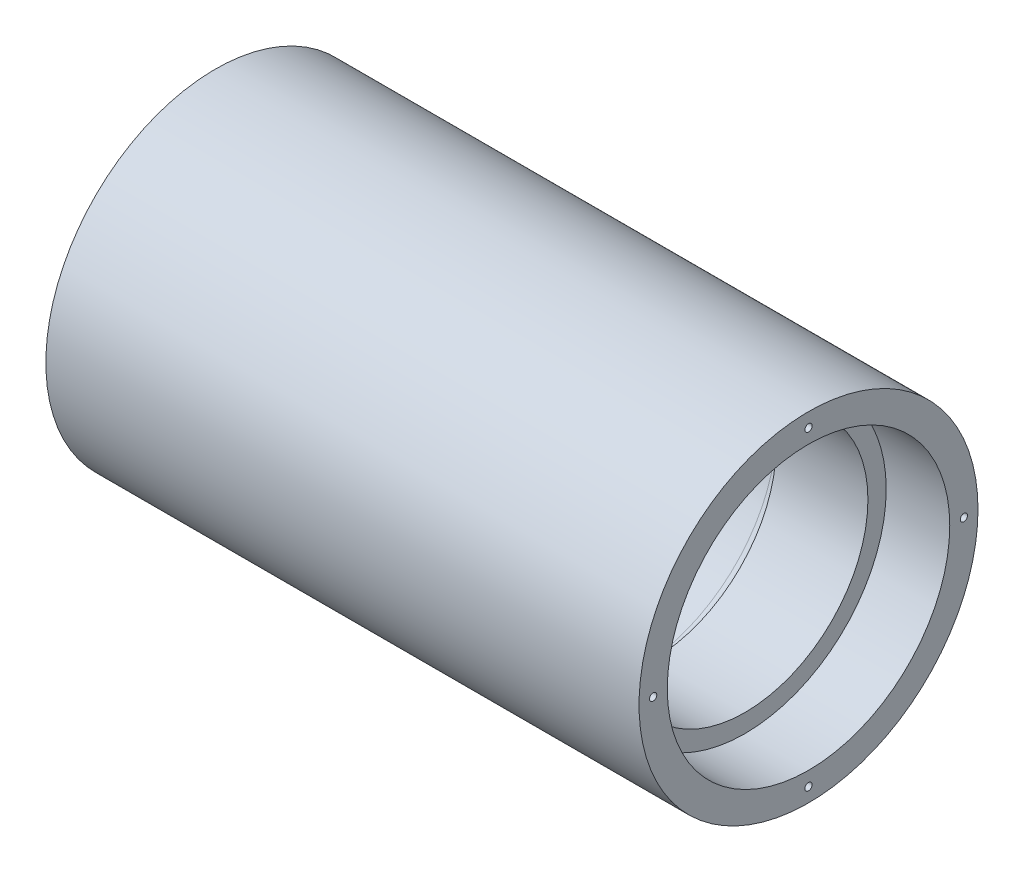
ISO-10303-21;
HEADER;
FILE_DESCRIPTION(('STEP AP214'),'2;1');
FILE_NAME('part.step','',(''),(''),'','','');
FILE_SCHEMA(('AUTOMOTIVE_DESIGN { 1 0 10303 214 1 1 1 1 }'));
ENDSEC;
DATA;
#1=APPLICATION_CONTEXT('core data for automotive mechanical design processes');
#2=APPLICATION_PROTOCOL_DEFINITION('international standard','automotive_design',2000,#1);
#3=PRODUCT_CONTEXT('',#1,'mechanical');
#4=PRODUCT('Part','Part','',(#3));
#5=PRODUCT_RELATED_PRODUCT_CATEGORY('part','',(#4));
#6=PRODUCT_DEFINITION_FORMATION('','',#4);
#7=PRODUCT_DEFINITION_CONTEXT('part definition',#1,'design');
#8=PRODUCT_DEFINITION('design','',#6,#7);
#9=PRODUCT_DEFINITION_SHAPE('','',#8);
#10=(LENGTH_UNIT() NAMED_UNIT(*) SI_UNIT(.MILLI.,.METRE.));
#11=(NAMED_UNIT(*) PLANE_ANGLE_UNIT() SI_UNIT($,.RADIAN.));
#12=(NAMED_UNIT(*) SI_UNIT($,.STERADIAN.) SOLID_ANGLE_UNIT());
#13=UNCERTAINTY_MEASURE_WITH_UNIT(LENGTH_MEASURE(1.E-05),#10,'distance_accuracy_value','');
#14=(GEOMETRIC_REPRESENTATION_CONTEXT(3) GLOBAL_UNCERTAINTY_ASSIGNED_CONTEXT((#13)) GLOBAL_UNIT_ASSIGNED_CONTEXT((#10,
#11,#12)) REPRESENTATION_CONTEXT('',''));
#15=CARTESIAN_POINT('',(0.,0.,0.));
#16=DIRECTION('',(0.,0.,1.));
#17=DIRECTION('',(1.,0.,0.));
#18=AXIS2_PLACEMENT_3D('',#15,#16,#17);
#19=CARTESIAN_POINT('',(-84.,0.,0.));
#20=DIRECTION('',(1.,0.,0.));
#21=DIRECTION('',(0.,0.,-1.));
#22=AXIS2_PLACEMENT_3D('',#19,#20,#21);
#23=CYLINDRICAL_SURFACE('',#22,31.);
#24=CARTESIAN_POINT('',(-50.,0.,0.));
#25=DIRECTION('',(1.,0.,0.));
#26=DIRECTION('',(0.,0.,-1.));
#27=AXIS2_PLACEMENT_3D('',#24,#25,#26);
#28=CIRCLE('',#27,31.);
#29=CARTESIAN_POINT('',(-50.,0.,-31.));
#30=VERTEX_POINT('',#29);
#31=EDGE_CURVE('E142',#30,#30,#28,.T.);
#32=CARTESIAN_POINT('',(-65.6,0.,0.));
#33=DIRECTION('',(-1.,0.,0.));
#34=DIRECTION('',(0.,0.,1.));
#35=AXIS2_PLACEMENT_3D('',#32,#33,#34);
#36=CIRCLE('',#35,31.);
#37=CARTESIAN_POINT('',(-65.6,0.,-31.));
#38=VERTEX_POINT('',#37);
#39=EDGE_CURVE('E44',#38,#38,#36,.F.);
#40=CARTESIAN_POINT('',(-50.,0.,-31.));
#41=CARTESIAN_POINT('',(-50.1625,0.,-31.));
#42=CARTESIAN_POINT('',(-50.325,0.,-31.));
#43=CARTESIAN_POINT('',(-50.65,0.,-31.));
#44=CARTESIAN_POINT('',(-50.8125,0.,-31.));
#45=CARTESIAN_POINT('',(-51.1375,0.,-31.));
#46=CARTESIAN_POINT('',(-51.3,0.,-31.));
#47=CARTESIAN_POINT('',(-51.625,0.,-31.));
#48=CARTESIAN_POINT('',(-51.7875,0.,-31.));
#49=CARTESIAN_POINT('',(-52.1125,0.,-31.));
#50=CARTESIAN_POINT('',(-52.275,0.,-31.));
#51=CARTESIAN_POINT('',(-52.6,0.,-31.));
#52=CARTESIAN_POINT('',(-52.7625,0.,-31.));
#53=CARTESIAN_POINT('',(-53.0875,0.,-31.));
#54=CARTESIAN_POINT('',(-53.25,0.,-31.));
#55=CARTESIAN_POINT('',(-53.575,0.,-31.));
#56=CARTESIAN_POINT('',(-53.7375,0.,-31.));
#57=CARTESIAN_POINT('',(-54.0625,0.,-31.));
#58=CARTESIAN_POINT('',(-54.225,0.,-31.));
#59=CARTESIAN_POINT('',(-54.55,0.,-31.));
#60=CARTESIAN_POINT('',(-54.7125,0.,-31.));
#61=CARTESIAN_POINT('',(-55.0375,0.,-31.));
#62=CARTESIAN_POINT('',(-55.2,0.,-31.));
#63=CARTESIAN_POINT('',(-55.525,0.,-31.));
#64=CARTESIAN_POINT('',(-55.6875,0.,-31.));
#65=CARTESIAN_POINT('',(-56.0125,0.,-31.));
#66=CARTESIAN_POINT('',(-56.175,0.,-31.));
#67=CARTESIAN_POINT('',(-56.5,0.,-31.));
#68=CARTESIAN_POINT('',(-56.6625,0.,-31.));
#69=CARTESIAN_POINT('',(-56.9875,0.,-31.));
#70=CARTESIAN_POINT('',(-57.15,0.,-31.));
#71=CARTESIAN_POINT('',(-57.475,0.,-31.));
#72=CARTESIAN_POINT('',(-57.6375,0.,-31.));
#73=CARTESIAN_POINT('',(-57.9625,0.,-31.));
#74=CARTESIAN_POINT('',(-58.125,0.,-31.));
#75=CARTESIAN_POINT('',(-58.45,0.,-31.));
#76=CARTESIAN_POINT('',(-58.6125,0.,-31.));
#77=CARTESIAN_POINT('',(-58.9375,0.,-31.));
#78=CARTESIAN_POINT('',(-59.1,0.,-31.));
#79=CARTESIAN_POINT('',(-59.425,0.,-31.));
#80=CARTESIAN_POINT('',(-59.5875,0.,-31.));
#81=CARTESIAN_POINT('',(-59.9125,0.,-31.));
#82=CARTESIAN_POINT('',(-60.075,0.,-31.));
#83=CARTESIAN_POINT('',(-60.4,0.,-31.));
#84=CARTESIAN_POINT('',(-60.5625,0.,-31.));
#85=CARTESIAN_POINT('',(-60.8875,0.,-31.));
#86=CARTESIAN_POINT('',(-61.05,0.,-31.));
#87=CARTESIAN_POINT('',(-61.375,0.,-31.));
#88=CARTESIAN_POINT('',(-61.5375,0.,-31.));
#89=CARTESIAN_POINT('',(-61.8625,0.,-31.));
#90=CARTESIAN_POINT('',(-62.025,0.,-31.));
#91=CARTESIAN_POINT('',(-62.35,0.,-31.));
#92=CARTESIAN_POINT('',(-62.5125,0.,-31.));
#93=CARTESIAN_POINT('',(-62.8375,0.,-31.));
#94=CARTESIAN_POINT('',(-63.,0.,-31.));
#95=CARTESIAN_POINT('',(-63.325,0.,-31.));
#96=CARTESIAN_POINT('',(-63.4875,0.,-31.));
#97=CARTESIAN_POINT('',(-63.8125,0.,-31.));
#98=CARTESIAN_POINT('',(-63.975,0.,-31.));
#99=CARTESIAN_POINT('',(-64.3,0.,-31.));
#100=CARTESIAN_POINT('',(-64.4625,0.,-31.));
#101=CARTESIAN_POINT('',(-64.7875,0.,-31.));
#102=CARTESIAN_POINT('',(-64.95,0.,-31.));
#103=CARTESIAN_POINT('',(-65.275,0.,-31.));
#104=CARTESIAN_POINT('',(-65.4375,0.,-31.));
#105=CARTESIAN_POINT('',(-65.6,0.,-31.));
#106=B_SPLINE_CURVE_WITH_KNOTS('',3,(#40,#41,#42,#43,#44,#45,#46,#47,#48,#49,#50,#51,#52,#53,
#54,#55,#56,#57,#58,#59,#60,#61,#62,#63,#64,#65,#66,#67,#68,#69,#70,#71,#72,#73,#74,#75,#76,#77,
#78,#79,#80,#81,#82,#83,#84,#85,#86,#87,#88,#89,#90,#91,#92,#93,#94,#95,#96,#97,#98,#99,#100,
#101,#102,#103,#104,#105),.UNSPECIFIED.,.F.,.F.,(4,2,2,2,2,2,2,2,2,2,2,2,2,2,2,2,2,2,2,2,2,2,2,
2,2,2,2,2,2,2,2,2,4),(0.,0.487500000000002,0.974999999999997,1.4625,1.95,2.4375,2.925,
3.41249999999999,3.89999999999999,4.3875,4.875,5.3625,5.84999999999999,6.3375,6.82499999999999,
7.31249999999999,7.79999999999999,8.2875,8.775,9.2625,9.74999999999999,10.2375,10.725,11.2125,
11.7,12.1875,12.675,13.1625,13.65,14.1375,14.625,15.1125,15.6),.UNSPECIFIED.);
#107=EDGE_CURVE('BSEAM40',#30,#38,#106,.T.);
#108=ORIENTED_EDGE('',*,*,#31,.T.);
#109=ORIENTED_EDGE('',*,*,#39,.F.);
#110=ORIENTED_EDGE('',*,*,#107,.T.);
#111=ORIENTED_EDGE('',*,*,#107,.F.);
#112=EDGE_LOOP('',(#108,#110,#109,#111));
#113=FACE_BOUND('',#112,.T.);
#114=ADVANCED_FACE('F40',(#113),#23,.F.);
#115=CARTESIAN_POINT('',(40.,0.,0.));
#116=DIRECTION('',(-1.,0.,0.));
#117=DIRECTION('',(0.,0.,1.));
#118=AXIS2_PLACEMENT_3D('',#115,#116,#117);
#119=CYLINDRICAL_SURFACE('',#118,40.);
#120=CARTESIAN_POINT('',(-45.,0.,0.));
#121=DIRECTION('',(1.,0.,0.));
#122=DIRECTION('',(0.,0.,-1.));
#123=AXIS2_PLACEMENT_3D('',#120,#121,#122);
#124=CIRCLE('',#123,40.);
#125=CARTESIAN_POINT('',(-45.,0.,-40.));
#126=VERTEX_POINT('',#125);
#127=EDGE_CURVE('E49',#126,#126,#124,.F.);
#128=ORIENTED_EDGE('',*,*,#127,.T.);
#129=EDGE_LOOP('',(#128));
#130=FACE_BOUND('',#129,.T.);
#131=CARTESIAN_POINT('',(35.,0.,0.));
#132=DIRECTION('',(1.,0.,0.));
#133=DIRECTION('',(0.,0.,-1.));
#134=AXIS2_PLACEMENT_3D('',#131,#132,#133);
#135=CIRCLE('',#134,40.);
#136=CARTESIAN_POINT('',(35.,0.,-40.));
#137=VERTEX_POINT('',#136);
#138=EDGE_CURVE('E157',#137,#137,#135,.T.);
#139=ORIENTED_EDGE('',*,*,#138,.T.);
#140=EDGE_LOOP('',(#139));
#141=FACE_BOUND('',#140,.T.);
#142=ADVANCED_FACE('F163',(#130,#141),#119,.F.);
#143=CARTESIAN_POINT('',(40.,0.,0.));
#144=DIRECTION('',(1.,0.,0.));
#145=DIRECTION('',(0.,0.,-1.));
#146=AXIS2_PLACEMENT_3D('',#143,#144,#145);
#147=PLANE('',#146);
#148=CARTESIAN_POINT('',(40.,0.,0.));
#149=DIRECTION('',(1.,0.,0.));
#150=DIRECTION('',(0.,0.,-1.));
#151=AXIS2_PLACEMENT_3D('',#148,#149,#150);
#152=CIRCLE('',#151,34.825);
#153=CARTESIAN_POINT('',(40.,0.,-34.825));
#154=VERTEX_POINT('',#153);
#155=EDGE_CURVE('E91',#154,#154,#152,.T.);
#156=ORIENTED_EDGE('',*,*,#155,.T.);
#157=EDGE_LOOP('',(#156));
#158=FACE_BOUND('',#157,.T.);
#159=CARTESIAN_POINT('',(40.,0.,0.));
#160=DIRECTION('',(1.,0.,0.));
#161=DIRECTION('',(0.,0.,-1.));
#162=AXIS2_PLACEMENT_3D('',#159,#160,#161);
#163=CIRCLE('',#162,35.);
#164=CARTESIAN_POINT('',(40.,0.,-35.));
#165=VERTEX_POINT('',#164);
#166=EDGE_CURVE('E11',#165,#165,#163,.F.);
#167=ORIENTED_EDGE('',*,*,#166,.T.);
#168=EDGE_LOOP('',(#167));
#169=FACE_BOUND('',#168,.T.);
#170=ADVANCED_FACE('F176',(#158,#169),#147,.F.);
#171=CARTESIAN_POINT('',(-50.,0.,0.));
#172=DIRECTION('',(1.,0.,0.));
#173=DIRECTION('',(0.,0.,-1.));
#174=AXIS2_PLACEMENT_3D('',#171,#172,#173);
#175=PLANE('',#174);
#176=CARTESIAN_POINT('',(-50.,0.,0.));
#177=DIRECTION('',(1.,0.,0.));
#178=DIRECTION('',(0.,0.,-1.));
#179=AXIS2_PLACEMENT_3D('',#176,#177,#178);
#180=CIRCLE('',#179,35.);
#181=CARTESIAN_POINT('',(-50.,0.,-35.));
#182=VERTEX_POINT('',#181);
#183=EDGE_CURVE('E152',#182,#182,#180,.T.);
#184=ORIENTED_EDGE('',*,*,#183,.T.);
#185=EDGE_LOOP('',(#184));
#186=FACE_BOUND('',#185,.T.);
#187=ORIENTED_EDGE('',*,*,#31,.F.);
#188=EDGE_LOOP('',(#187));
#189=FACE_BOUND('',#188,.T.);
#190=ADVANCED_FACE('F172',(#186,#189),#175,.T.);
#191=CARTESIAN_POINT('',(-84.,0.,0.));
#192=DIRECTION('',(1.,0.,0.));
#193=DIRECTION('',(0.,0.,-1.));
#194=AXIS2_PLACEMENT_3D('',#191,#192,#193);
#195=CYLINDRICAL_SURFACE('',#194,48.);
#196=CARTESIAN_POINT('',(-84.,0.,0.));
#197=DIRECTION('',(1.,0.,0.));
#198=DIRECTION('',(0.,0.,-1.));
#199=AXIS2_PLACEMENT_3D('',#196,#197,#198);
#200=CIRCLE('',#199,48.);
#201=CARTESIAN_POINT('',(-84.,0.,-48.));
#202=VERTEX_POINT('',#201);
#203=EDGE_CURVE('E149',#202,#202,#200,.T.);
#204=CARTESIAN_POINT('',(84.,0.,0.));
#205=DIRECTION('',(1.,0.,0.));
#206=DIRECTION('',(0.,0.,-1.));
#207=AXIS2_PLACEMENT_3D('',#204,#205,#206);
#208=CIRCLE('',#207,48.);
#209=CARTESIAN_POINT('',(84.,0.,-48.));
#210=VERTEX_POINT('',#209);
#211=EDGE_CURVE('E146',#210,#210,#208,.T.);
#212=CARTESIAN_POINT('',(-84.,0.,-48.));
#213=CARTESIAN_POINT('',(-82.25,0.,-48.));
#214=CARTESIAN_POINT('',(-80.5,0.,-48.));
#215=CARTESIAN_POINT('',(-77.,0.,-48.));
#216=CARTESIAN_POINT('',(-75.25,0.,-48.));
#217=CARTESIAN_POINT('',(-71.75,0.,-48.));
#218=CARTESIAN_POINT('',(-70.,0.,-48.));
#219=CARTESIAN_POINT('',(-66.5,0.,-48.));
#220=CARTESIAN_POINT('',(-64.75,0.,-48.));
#221=CARTESIAN_POINT('',(-61.25,0.,-48.));
#222=CARTESIAN_POINT('',(-59.5,0.,-48.));
#223=CARTESIAN_POINT('',(-56.,0.,-48.));
#224=CARTESIAN_POINT('',(-54.25,0.,-48.));
#225=CARTESIAN_POINT('',(-50.75,0.,-48.));
#226=CARTESIAN_POINT('',(-49.,0.,-48.));
#227=CARTESIAN_POINT('',(-45.5,0.,-48.));
#228=CARTESIAN_POINT('',(-43.75,0.,-48.));
#229=CARTESIAN_POINT('',(-40.25,0.,-48.));
#230=CARTESIAN_POINT('',(-38.5,0.,-48.));
#231=CARTESIAN_POINT('',(-35.,0.,-48.));
#232=CARTESIAN_POINT('',(-33.25,0.,-48.));
#233=CARTESIAN_POINT('',(-29.75,0.,-48.));
#234=CARTESIAN_POINT('',(-28.,0.,-48.));
#235=CARTESIAN_POINT('',(-24.5,0.,-48.));
#236=CARTESIAN_POINT('',(-22.75,0.,-48.));
#237=CARTESIAN_POINT('',(-19.25,0.,-48.));
#238=CARTESIAN_POINT('',(-17.5,0.,-48.));
#239=CARTESIAN_POINT('',(-14.,0.,-48.));
#240=CARTESIAN_POINT('',(-12.25,0.,-48.));
#241=CARTESIAN_POINT('',(-8.75000000000002,0.,-48.));
#242=CARTESIAN_POINT('',(-7.00000000000002,0.,-48.));
#243=CARTESIAN_POINT('',(-3.50000000000002,0.,-48.));
#244=CARTESIAN_POINT('',(-1.75000000000002,0.,-48.));
#245=CARTESIAN_POINT('',(1.74999999999999,0.,-48.));
#246=CARTESIAN_POINT('',(3.49999999999999,0.,-48.));
#247=CARTESIAN_POINT('',(6.99999999999999,0.,-48.));
#248=CARTESIAN_POINT('',(8.74999999999999,0.,-48.));
#249=CARTESIAN_POINT('',(12.25,0.,-48.));
#250=CARTESIAN_POINT('',(14.,0.,-48.));
#251=CARTESIAN_POINT('',(17.5,0.,-48.));
#252=CARTESIAN_POINT('',(19.25,0.,-48.));
#253=CARTESIAN_POINT('',(22.75,0.,-48.));
#254=CARTESIAN_POINT('',(24.5,0.,-48.));
#255=CARTESIAN_POINT('',(28.,0.,-48.));
#256=CARTESIAN_POINT('',(29.75,0.,-48.));
#257=CARTESIAN_POINT('',(33.25,0.,-48.));
#258=CARTESIAN_POINT('',(35.,0.,-48.));
#259=CARTESIAN_POINT('',(38.5,0.,-48.));
#260=CARTESIAN_POINT('',(40.25,0.,-48.));
#261=CARTESIAN_POINT('',(43.75,0.,-48.));
#262=CARTESIAN_POINT('',(45.5,0.,-48.));
#263=CARTESIAN_POINT('',(49.,0.,-48.));
#264=CARTESIAN_POINT('',(50.75,0.,-48.));
#265=CARTESIAN_POINT('',(54.25,0.,-48.));
#266=CARTESIAN_POINT('',(56.,0.,-48.));
#267=CARTESIAN_POINT('',(59.5,0.,-48.));
#268=CARTESIAN_POINT('',(61.25,0.,-48.));
#269=CARTESIAN_POINT('',(64.75,0.,-48.));
#270=CARTESIAN_POINT('',(66.5,0.,-48.));
#271=CARTESIAN_POINT('',(70.,0.,-48.));
#272=CARTESIAN_POINT('',(71.75,0.,-48.));
#273=CARTESIAN_POINT('',(75.25,0.,-48.));
#274=CARTESIAN_POINT('',(77.,0.,-48.));
#275=CARTESIAN_POINT('',(80.5,0.,-48.));
#276=CARTESIAN_POINT('',(82.25,0.,-48.));
#277=CARTESIAN_POINT('',(84.,0.,-48.));
#278=B_SPLINE_CURVE_WITH_KNOTS('',3,(#212,#213,#214,#215,#216,#217,#218,#219,#220,#221,#222,
#223,#224,#225,#226,#227,#228,#229,#230,#231,#232,#233,#234,#235,#236,#237,#238,#239,#240,#241,
#242,#243,#244,#245,#246,#247,#248,#249,#250,#251,#252,#253,#254,#255,#256,#257,#258,#259,#260,
#261,#262,#263,#264,#265,#266,#267,#268,#269,#270,#271,#272,#273,#274,#275,#276,#277),
.UNSPECIFIED.,.F.,.F.,(4,2,2,2,2,2,2,2,2,2,2,2,2,2,2,2,2,2,2,2,2,2,2,2,2,2,2,2,2,2,2,2,4),(0.,
5.25,10.5,15.75,21.,26.25,31.5,36.75,42.,47.25,52.5,57.75,63.,68.25,73.5,78.75,84.,89.25,94.5,
99.75,105.,110.25,115.5,120.75,126.,131.25,136.5,141.75,147.,152.25,157.5,162.75,168.),.UNSPECIFIED.);
#279=EDGE_CURVE('BSEAM175',#202,#210,#278,.T.);
#280=ORIENTED_EDGE('',*,*,#203,.T.);
#281=ORIENTED_EDGE('',*,*,#211,.F.);
#282=ORIENTED_EDGE('',*,*,#279,.T.);
#283=ORIENTED_EDGE('',*,*,#279,.F.);
#284=EDGE_LOOP('',(#280,#282,#281,#283));
#285=FACE_BOUND('',#284,.T.);
#286=ADVANCED_FACE('F175',(#285),#195,.T.);
#287=CARTESIAN_POINT('',(-84.,0.,0.));
#288=DIRECTION('',(1.,0.,0.));
#289=DIRECTION('',(0.,0.,-1.));
#290=AXIS2_PLACEMENT_3D('',#287,#288,#289);
#291=PLANE('',#290);
#292=CARTESIAN_POINT('',(-84.,41.,0.));
#293=DIRECTION('',(-1.,0.,0.));
#294=DIRECTION('',(0.,0.,1.));
#295=AXIS2_PLACEMENT_3D('',#292,#293,#294);
#296=CIRCLE('',#295,1.025);
#297=CARTESIAN_POINT('',(-84.,41.,1.025));
#298=VERTEX_POINT('',#297);
#299=EDGE_CURVE('E85',#298,#298,#296,.T.);
#300=ORIENTED_EDGE('',*,*,#299,.F.);
#301=EDGE_LOOP('',(#300));
#302=FACE_BOUND('',#301,.T.);
#303=CARTESIAN_POINT('',(-84.,-41.,0.));
#304=DIRECTION('',(-1.,0.,0.));
#305=DIRECTION('',(0.,0.,1.));
#306=AXIS2_PLACEMENT_3D('',#303,#304,#305);
#307=CIRCLE('',#306,1.025);
#308=CARTESIAN_POINT('',(-84.,-41.,1.025));
#309=VERTEX_POINT('',#308);
#310=EDGE_CURVE('E84',#309,#309,#307,.T.);
#311=ORIENTED_EDGE('',*,*,#310,.F.);
#312=EDGE_LOOP('',(#311));
#313=FACE_BOUND('',#312,.T.);
#314=CARTESIAN_POINT('',(-84.,0.,41.));
#315=DIRECTION('',(-1.,0.,0.));
#316=DIRECTION('',(0.,0.,1.));
#317=AXIS2_PLACEMENT_3D('',#314,#315,#316);
#318=CIRCLE('',#317,1.025);
#319=CARTESIAN_POINT('',(-84.,0.,42.025));
#320=VERTEX_POINT('',#319);
#321=EDGE_CURVE('E97',#320,#320,#318,.T.);
#322=ORIENTED_EDGE('',*,*,#321,.F.);
#323=EDGE_LOOP('',(#322));
#324=FACE_BOUND('',#323,.T.);
#325=CARTESIAN_POINT('',(-84.,0.,-41.));
#326=DIRECTION('',(-1.,0.,0.));
#327=DIRECTION('',(0.,0.,1.));
#328=AXIS2_PLACEMENT_3D('',#325,#326,#327);
#329=CIRCLE('',#328,1.025);
#330=CARTESIAN_POINT('',(-84.,0.,-39.975));
#331=VERTEX_POINT('',#330);
#332=EDGE_CURVE('E103',#331,#331,#329,.T.);
#333=ORIENTED_EDGE('',*,*,#332,.F.);
#334=EDGE_LOOP('',(#333));
#335=FACE_BOUND('',#334,.T.);
#336=CARTESIAN_POINT('',(-84.,0.,0.));
#337=DIRECTION('',(-1.,0.,0.));
#338=DIRECTION('',(0.,0.,1.));
#339=AXIS2_PLACEMENT_3D('',#336,#337,#338);
#340=CIRCLE('',#339,34.);
#341=CARTESIAN_POINT('',(-84.,0.,34.));
#342=VERTEX_POINT('',#341);
#343=EDGE_CURVE('E133',#342,#342,#340,.T.);
#344=ORIENTED_EDGE('',*,*,#343,.F.);
#345=EDGE_LOOP('',(#344));
#346=FACE_BOUND('',#345,.T.);
#347=ORIENTED_EDGE('',*,*,#203,.F.);
#348=EDGE_LOOP('',(#347));
#349=FACE_BOUND('',#348,.T.);
#350=ADVANCED_FACE('F215',(#302,#313,#324,#335,#346,#349),#291,.F.);
#351=CARTESIAN_POINT('',(84.,0.,0.));
#352=DIRECTION('',(1.,0.,0.));
#353=DIRECTION('',(0.,0.,-1.));
#354=AXIS2_PLACEMENT_3D('',#351,#352,#353);
#355=PLANE('',#354);
#356=CARTESIAN_POINT('',(84.,-44.,0.));
#357=DIRECTION('',(1.,0.,0.));
#358=DIRECTION('',(0.,0.,-1.));
#359=AXIS2_PLACEMENT_3D('',#356,#357,#358);
#360=CIRCLE('',#359,1.025);
#361=CARTESIAN_POINT('',(84.,-44.,-1.025));
#362=VERTEX_POINT('',#361);
#363=EDGE_CURVE('E109',#362,#362,#360,.T.);
#364=ORIENTED_EDGE('',*,*,#363,.F.);
#365=EDGE_LOOP('',(#364));
#366=FACE_BOUND('',#365,.T.);
#367=CARTESIAN_POINT('',(84.,0.,44.));
#368=DIRECTION('',(1.,0.,0.));
#369=DIRECTION('',(0.,0.,-1.));
#370=AXIS2_PLACEMENT_3D('',#367,#368,#369);
#371=CIRCLE('',#370,1.025);
#372=CARTESIAN_POINT('',(84.,0.,42.975));
#373=VERTEX_POINT('',#372);
#374=EDGE_CURVE('E115',#373,#373,#371,.T.);
#375=ORIENTED_EDGE('',*,*,#374,.F.);
#376=EDGE_LOOP('',(#375));
#377=FACE_BOUND('',#376,.T.);
#378=CARTESIAN_POINT('',(84.,44.,0.));
#379=DIRECTION('',(1.,0.,0.));
#380=DIRECTION('',(0.,0.,-1.));
#381=AXIS2_PLACEMENT_3D('',#378,#379,#380);
#382=CIRCLE('',#381,1.025);
#383=CARTESIAN_POINT('',(84.,44.,-1.025));
#384=VERTEX_POINT('',#383);
#385=EDGE_CURVE('E121',#384,#384,#382,.T.);
#386=ORIENTED_EDGE('',*,*,#385,.F.);
#387=EDGE_LOOP('',(#386));
#388=FACE_BOUND('',#387,.T.);
#389=CARTESIAN_POINT('',(84.,0.,-44.));
#390=DIRECTION('',(1.,0.,0.));
#391=DIRECTION('',(0.,0.,-1.));
#392=AXIS2_PLACEMENT_3D('',#389,#390,#391);
#393=CIRCLE('',#392,1.025);
#394=CARTESIAN_POINT('',(84.,0.,-45.025));
#395=VERTEX_POINT('',#394);
#396=EDGE_CURVE('E127',#395,#395,#393,.T.);
#397=ORIENTED_EDGE('',*,*,#396,.F.);
#398=EDGE_LOOP('',(#397));
#399=FACE_BOUND('',#398,.T.);
#400=CARTESIAN_POINT('',(84.,0.,0.));
#401=DIRECTION('',(1.,0.,0.));
#402=DIRECTION('',(0.,0.,-1.));
#403=AXIS2_PLACEMENT_3D('',#400,#401,#402);
#404=CIRCLE('',#403,40.);
#405=CARTESIAN_POINT('',(84.,0.,-40.));
#406=VERTEX_POINT('',#405);
#407=EDGE_CURVE('E143',#406,#406,#404,.F.);
#408=ORIENTED_EDGE('',*,*,#407,.T.);
#409=EDGE_LOOP('',(#408));
#410=FACE_BOUND('',#409,.T.);
#411=ORIENTED_EDGE('',*,*,#211,.T.);
#412=EDGE_LOOP('',(#411));
#413=FACE_BOUND('',#412,.T.);
#414=ADVANCED_FACE('F169',(#366,#377,#388,#399,#410,#413),#355,.T.);
#415=CARTESIAN_POINT('',(-45.,0.,0.));
#416=DIRECTION('',(1.,0.,0.));
#417=DIRECTION('',(0.,0.,-1.));
#418=AXIS2_PLACEMENT_3D('',#415,#416,#417);
#419=TOROIDAL_SURFACE('',#418,35.,5.);
#420=ORIENTED_EDGE('',*,*,#127,.F.);
#421=EDGE_LOOP('',(#420));
#422=FACE_BOUND('',#421,.T.);
#423=ORIENTED_EDGE('',*,*,#183,.F.);
#424=EDGE_LOOP('',(#423));
#425=FACE_BOUND('',#424,.T.);
#426=ADVANCED_FACE('F166',(#422,#425),#419,.F.);
#427=CARTESIAN_POINT('',(35.,0.,0.));
#428=DIRECTION('',(1.,0.,0.));
#429=DIRECTION('',(0.,0.,-1.));
#430=AXIS2_PLACEMENT_3D('',#427,#428,#429);
#431=TOROIDAL_SURFACE('',#430,35.,5.);
#432=ORIENTED_EDGE('',*,*,#166,.F.);
#433=EDGE_LOOP('',(#432));
#434=FACE_BOUND('',#433,.T.);
#435=ORIENTED_EDGE('',*,*,#138,.F.);
#436=EDGE_LOOP('',(#435));
#437=FACE_BOUND('',#436,.T.);
#438=ADVANCED_FACE('F42',(#434,#437),#431,.F.);
#439=CARTESIAN_POINT('',(84.001,0.,0.));
#440=DIRECTION('',(-1.,0.,0.));
#441=DIRECTION('',(0.,-1.,0.));
#442=AXIS2_PLACEMENT_3D('',#439,#440,#441);
#443=CYLINDRICAL_SURFACE('',#442,40.);
#444=ORIENTED_EDGE('',*,*,#407,.F.);
#445=EDGE_LOOP('',(#444));
#446=FACE_BOUND('',#445,.T.);
#447=CARTESIAN_POINT('',(66.,0.,0.));
#448=DIRECTION('',(-1.,0.,0.));
#449=DIRECTION('',(0.,-1.,0.));
#450=AXIS2_PLACEMENT_3D('',#447,#448,#449);
#451=CIRCLE('',#450,40.);
#452=CARTESIAN_POINT('',(66.,-40.,0.));
#453=VERTEX_POINT('',#452);
#454=EDGE_CURVE('E139',#453,#453,#451,.T.);
#455=ORIENTED_EDGE('',*,*,#454,.T.);
#456=EDGE_LOOP('',(#455));
#457=FACE_BOUND('',#456,.T.);
#458=ADVANCED_FACE('F199',(#446,#457),#443,.F.);
#459=CARTESIAN_POINT('',(66.,0.,0.));
#460=DIRECTION('',(-1.,0.,0.));
#461=DIRECTION('',(0.,-1.,0.));
#462=AXIS2_PLACEMENT_3D('',#459,#460,#461);
#463=PLANE('',#462);
#464=CARTESIAN_POINT('',(66.,0.,0.));
#465=DIRECTION('',(1.,0.,0.));
#466=DIRECTION('',(0.,0.,-1.));
#467=AXIS2_PLACEMENT_3D('',#464,#465,#466);
#468=CIRCLE('',#467,34.825);
#469=CARTESIAN_POINT('',(66.,0.,-34.825));
#470=VERTEX_POINT('',#469);
#471=EDGE_CURVE('E626',#470,#470,#468,.T.);
#472=ORIENTED_EDGE('',*,*,#471,.F.);
#473=EDGE_LOOP('',(#472));
#474=FACE_BOUND('',#473,.T.);
#475=ORIENTED_EDGE('',*,*,#454,.F.);
#476=EDGE_LOOP('',(#475));
#477=FACE_BOUND('',#476,.T.);
#478=ADVANCED_FACE('F189',(#474,#477),#463,.F.);
#479=CARTESIAN_POINT('',(-65.6,0.,0.));
#480=DIRECTION('',(-1.,0.,0.));
#481=DIRECTION('',(0.,0.,1.));
#482=AXIS2_PLACEMENT_3D('',#479,#480,#481);
#483=PLANE('',#482);
#484=CARTESIAN_POINT('',(-65.6,0.,0.));
#485=DIRECTION('',(-1.,0.,0.));
#486=DIRECTION('',(0.,0.,1.));
#487=AXIS2_PLACEMENT_3D('',#484,#485,#486);
#488=CIRCLE('',#487,34.);
#489=CARTESIAN_POINT('',(-65.6,0.,34.));
#490=VERTEX_POINT('',#489);
#491=EDGE_CURVE('E134',#490,#490,#488,.T.);
#492=ORIENTED_EDGE('',*,*,#491,.T.);
#493=EDGE_LOOP('',(#492));
#494=FACE_BOUND('',#493,.T.);
#495=ORIENTED_EDGE('',*,*,#39,.T.);
#496=EDGE_LOOP('',(#495));
#497=FACE_BOUND('',#496,.T.);
#498=ADVANCED_FACE('F186',(#494,#497),#483,.T.);
#499=CARTESIAN_POINT('',(-65.6,0.,0.));
#500=DIRECTION('',(-1.,0.,0.));
#501=DIRECTION('',(0.,0.,1.));
#502=AXIS2_PLACEMENT_3D('',#499,#500,#501);
#503=CYLINDRICAL_SURFACE('',#502,34.);
#504=ORIENTED_EDGE('',*,*,#491,.F.);
#505=EDGE_LOOP('',(#504));
#506=FACE_BOUND('',#505,.T.);
#507=ORIENTED_EDGE('',*,*,#343,.T.);
#508=EDGE_LOOP('',(#507));
#509=FACE_BOUND('',#508,.T.);
#510=ADVANCED_FACE('F188',(#506,#509),#503,.F.);
#511=CARTESIAN_POINT('',(76.,0.,-44.));
#512=DIRECTION('',(1.,0.,0.));
#513=DIRECTION('',(0.,0.,-1.));
#514=AXIS2_PLACEMENT_3D('',#511,#512,#513);
#515=CONICAL_SURFACE('',#514,1.025,1.02974425867665);
#516=CARTESIAN_POINT('',(75.3841178654968,0.,-44.));
#517=VERTEX_POINT('',#516);
#518=VERTEX_LOOP('',#517);
#519=FACE_BOUND('',#518,.T.);
#520=CARTESIAN_POINT('',(76.,0.,-44.));
#521=DIRECTION('',(1.,0.,0.));
#522=DIRECTION('',(0.,0.,-1.));
#523=AXIS2_PLACEMENT_3D('',#520,#521,#522);
#524=CIRCLE('',#523,1.025);
#525=CARTESIAN_POINT('',(76.,0.,-45.025));
#526=VERTEX_POINT('',#525);
#527=EDGE_CURVE('E130',#526,#526,#524,.T.);
#528=ORIENTED_EDGE('',*,*,#527,.T.);
#529=EDGE_LOOP('',(#528));
#530=FACE_BOUND('',#529,.T.);
#531=ADVANCED_FACE('F196',(#519,#530),#515,.F.);
#532=CARTESIAN_POINT('',(84.,0.,-44.));
#533=DIRECTION('',(1.,0.,0.));
#534=DIRECTION('',(0.,0.,-1.));
#535=AXIS2_PLACEMENT_3D('',#532,#533,#534);
#536=CYLINDRICAL_SURFACE('',#535,1.025);
#537=ORIENTED_EDGE('',*,*,#527,.F.);
#538=EDGE_LOOP('',(#537));
#539=FACE_BOUND('',#538,.T.);
#540=ORIENTED_EDGE('',*,*,#396,.T.);
#541=EDGE_LOOP('',(#540));
#542=FACE_BOUND('',#541,.T.);
#543=ADVANCED_FACE('F395',(#539,#542),#536,.F.);
#544=CARTESIAN_POINT('',(76.,44.,0.));
#545=DIRECTION('',(1.,0.,0.));
#546=DIRECTION('',(0.,0.,-1.));
#547=AXIS2_PLACEMENT_3D('',#544,#545,#546);
#548=CONICAL_SURFACE('',#547,1.025,1.02974425867665);
#549=CARTESIAN_POINT('',(75.3841178654968,44.,0.));
#550=VERTEX_POINT('',#549);
#551=VERTEX_LOOP('',#550);
#552=FACE_BOUND('',#551,.T.);
#553=CARTESIAN_POINT('',(76.,44.,0.));
#554=DIRECTION('',(1.,0.,0.));
#555=DIRECTION('',(0.,0.,-1.));
#556=AXIS2_PLACEMENT_3D('',#553,#554,#555);
#557=CIRCLE('',#556,1.025);
#558=CARTESIAN_POINT('',(76.,44.,-1.025));
#559=VERTEX_POINT('',#558);
#560=EDGE_CURVE('E124',#559,#559,#557,.T.);
#561=ORIENTED_EDGE('',*,*,#560,.T.);
#562=EDGE_LOOP('',(#561));
#563=FACE_BOUND('',#562,.T.);
#564=ADVANCED_FACE('F386',(#552,#563),#548,.F.);
#565=CARTESIAN_POINT('',(84.,44.,0.));
#566=DIRECTION('',(1.,0.,0.));
#567=DIRECTION('',(0.,0.,-1.));
#568=AXIS2_PLACEMENT_3D('',#565,#566,#567);
#569=CYLINDRICAL_SURFACE('',#568,1.025);
#570=ORIENTED_EDGE('',*,*,#560,.F.);
#571=EDGE_LOOP('',(#570));
#572=FACE_BOUND('',#571,.T.);
#573=ORIENTED_EDGE('',*,*,#385,.T.);
#574=EDGE_LOOP('',(#573));
#575=FACE_BOUND('',#574,.T.);
#576=ADVANCED_FACE('F378',(#572,#575),#569,.F.);
#577=CARTESIAN_POINT('',(76.,0.,44.));
#578=DIRECTION('',(1.,0.,0.));
#579=DIRECTION('',(0.,0.,-1.));
#580=AXIS2_PLACEMENT_3D('',#577,#578,#579);
#581=CONICAL_SURFACE('',#580,1.025,1.02974425867665);
#582=CARTESIAN_POINT('',(75.3841178654968,0.,44.));
#583=VERTEX_POINT('',#582);
#584=VERTEX_LOOP('',#583);
#585=FACE_BOUND('',#584,.T.);
#586=CARTESIAN_POINT('',(76.,0.,44.));
#587=DIRECTION('',(1.,0.,0.));
#588=DIRECTION('',(0.,0.,-1.));
#589=AXIS2_PLACEMENT_3D('',#586,#587,#588);
#590=CIRCLE('',#589,1.025);
#591=CARTESIAN_POINT('',(76.,0.,42.975));
#592=VERTEX_POINT('',#591);
#593=EDGE_CURVE('E118',#592,#592,#590,.T.);
#594=ORIENTED_EDGE('',*,*,#593,.T.);
#595=EDGE_LOOP('',(#594));
#596=FACE_BOUND('',#595,.T.);
#597=ADVANCED_FACE('F369',(#585,#596),#581,.F.);
#598=CARTESIAN_POINT('',(84.,0.,44.));
#599=DIRECTION('',(1.,0.,0.));
#600=DIRECTION('',(0.,0.,-1.));
#601=AXIS2_PLACEMENT_3D('',#598,#599,#600);
#602=CYLINDRICAL_SURFACE('',#601,1.025);
#603=ORIENTED_EDGE('',*,*,#593,.F.);
#604=EDGE_LOOP('',(#603));
#605=FACE_BOUND('',#604,.T.);
#606=ORIENTED_EDGE('',*,*,#374,.T.);
#607=EDGE_LOOP('',(#606));
#608=FACE_BOUND('',#607,.T.);
#609=ADVANCED_FACE('F360',(#605,#608),#602,.F.);
#610=CARTESIAN_POINT('',(76.,-44.,0.));
#611=DIRECTION('',(1.,0.,0.));
#612=DIRECTION('',(0.,0.,-1.));
#613=AXIS2_PLACEMENT_3D('',#610,#611,#612);
#614=CONICAL_SURFACE('',#613,1.025,1.02974425867665);
#615=CARTESIAN_POINT('',(75.3841178654968,-44.,0.));
#616=VERTEX_POINT('',#615);
#617=VERTEX_LOOP('',#616);
#618=FACE_BOUND('',#617,.T.);
#619=CARTESIAN_POINT('',(76.,-44.,0.));
#620=DIRECTION('',(1.,0.,0.));
#621=DIRECTION('',(0.,0.,-1.));
#622=AXIS2_PLACEMENT_3D('',#619,#620,#621);
#623=CIRCLE('',#622,1.025);
#624=CARTESIAN_POINT('',(76.,-44.,-1.025));
#625=VERTEX_POINT('',#624);
#626=EDGE_CURVE('E112',#625,#625,#623,.T.);
#627=ORIENTED_EDGE('',*,*,#626,.T.);
#628=EDGE_LOOP('',(#627));
#629=FACE_BOUND('',#628,.T.);
#630=ADVANCED_FACE('F351',(#618,#629),#614,.F.);
#631=CARTESIAN_POINT('',(84.,-44.,0.));
#632=DIRECTION('',(1.,0.,0.));
#633=DIRECTION('',(0.,0.,-1.));
#634=AXIS2_PLACEMENT_3D('',#631,#632,#633);
#635=CYLINDRICAL_SURFACE('',#634,1.025);
#636=ORIENTED_EDGE('',*,*,#626,.F.);
#637=EDGE_LOOP('',(#636));
#638=FACE_BOUND('',#637,.T.);
#639=ORIENTED_EDGE('',*,*,#363,.T.);
#640=EDGE_LOOP('',(#639));
#641=FACE_BOUND('',#640,.T.);
#642=ADVANCED_FACE('F342',(#638,#641),#635,.F.);
#643=CARTESIAN_POINT('',(-76.,0.,-41.));
#644=DIRECTION('',(-1.,0.,0.));
#645=DIRECTION('',(0.,0.,1.));
#646=AXIS2_PLACEMENT_3D('',#643,#644,#645);
#647=CONICAL_SURFACE('',#646,1.025,1.02974425867665);
#648=CARTESIAN_POINT('',(-75.3841178654968,0.,-41.));
#649=VERTEX_POINT('',#648);
#650=VERTEX_LOOP('',#649);
#651=FACE_BOUND('',#650,.T.);
#652=CARTESIAN_POINT('',(-76.,0.,-41.));
#653=DIRECTION('',(-1.,0.,0.));
#654=DIRECTION('',(0.,0.,1.));
#655=AXIS2_PLACEMENT_3D('',#652,#653,#654);
#656=CIRCLE('',#655,1.025);
#657=CARTESIAN_POINT('',(-76.,0.,-39.975));
#658=VERTEX_POINT('',#657);
#659=EDGE_CURVE('E106',#658,#658,#656,.T.);
#660=ORIENTED_EDGE('',*,*,#659,.T.);
#661=EDGE_LOOP('',(#660));
#662=FACE_BOUND('',#661,.T.);
#663=ADVANCED_FACE('F334',(#651,#662),#647,.F.);
#664=CARTESIAN_POINT('',(-84.,0.,-41.));
#665=DIRECTION('',(-1.,0.,0.));
#666=DIRECTION('',(0.,0.,1.));
#667=AXIS2_PLACEMENT_3D('',#664,#665,#666);
#668=CYLINDRICAL_SURFACE('',#667,1.025);
#669=ORIENTED_EDGE('',*,*,#659,.F.);
#670=EDGE_LOOP('',(#669));
#671=FACE_BOUND('',#670,.T.);
#672=ORIENTED_EDGE('',*,*,#332,.T.);
#673=EDGE_LOOP('',(#672));
#674=FACE_BOUND('',#673,.T.);
#675=ADVANCED_FACE('F326',(#671,#674),#668,.F.);
#676=CARTESIAN_POINT('',(-76.,0.,41.));
#677=DIRECTION('',(-1.,0.,0.));
#678=DIRECTION('',(0.,0.,1.));
#679=AXIS2_PLACEMENT_3D('',#676,#677,#678);
#680=CONICAL_SURFACE('',#679,1.025,1.02974425867665);
#681=CARTESIAN_POINT('',(-75.3841178654968,0.,41.));
#682=VERTEX_POINT('',#681);
#683=VERTEX_LOOP('',#682);
#684=FACE_BOUND('',#683,.T.);
#685=CARTESIAN_POINT('',(-76.,0.,41.));
#686=DIRECTION('',(-1.,0.,0.));
#687=DIRECTION('',(0.,0.,1.));
#688=AXIS2_PLACEMENT_3D('',#685,#686,#687);
#689=CIRCLE('',#688,1.025);
#690=CARTESIAN_POINT('',(-76.,0.,42.025));
#691=VERTEX_POINT('',#690);
#692=EDGE_CURVE('E100',#691,#691,#689,.T.);
#693=ORIENTED_EDGE('',*,*,#692,.T.);
#694=EDGE_LOOP('',(#693));
#695=FACE_BOUND('',#694,.T.);
#696=ADVANCED_FACE('F317',(#684,#695),#680,.F.);
#697=CARTESIAN_POINT('',(-84.,0.,41.));
#698=DIRECTION('',(-1.,0.,0.));
#699=DIRECTION('',(0.,0.,1.));
#700=AXIS2_PLACEMENT_3D('',#697,#698,#699);
#701=CYLINDRICAL_SURFACE('',#700,1.025);
#702=ORIENTED_EDGE('',*,*,#692,.F.);
#703=EDGE_LOOP('',(#702));
#704=FACE_BOUND('',#703,.T.);
#705=ORIENTED_EDGE('',*,*,#321,.T.);
#706=EDGE_LOOP('',(#705));
#707=FACE_BOUND('',#706,.T.);
#708=ADVANCED_FACE('F309',(#704,#707),#701,.F.);
#709=CARTESIAN_POINT('',(-76.,-41.,0.));
#710=DIRECTION('',(-1.,0.,0.));
#711=DIRECTION('',(0.,0.,1.));
#712=AXIS2_PLACEMENT_3D('',#709,#710,#711);
#713=CONICAL_SURFACE('',#712,1.025,1.02974425867665);
#714=CARTESIAN_POINT('',(-75.3841178654968,-41.,0.));
#715=VERTEX_POINT('',#714);
#716=VERTEX_LOOP('',#715);
#717=FACE_BOUND('',#716,.T.);
#718=CARTESIAN_POINT('',(-76.,-41.,0.));
#719=DIRECTION('',(-1.,0.,0.));
#720=DIRECTION('',(0.,0.,1.));
#721=AXIS2_PLACEMENT_3D('',#718,#719,#720);
#722=CIRCLE('',#721,1.025);
#723=CARTESIAN_POINT('',(-76.,-41.,1.025));
#724=VERTEX_POINT('',#723);
#725=EDGE_CURVE('E88',#724,#724,#722,.T.);
#726=ORIENTED_EDGE('',*,*,#725,.T.);
#727=EDGE_LOOP('',(#726));
#728=FACE_BOUND('',#727,.T.);
#729=ADVANCED_FACE('F300',(#717,#728),#713,.F.);
#730=CARTESIAN_POINT('',(-84.,-41.,0.));
#731=DIRECTION('',(-1.,0.,0.));
#732=DIRECTION('',(0.,0.,1.));
#733=AXIS2_PLACEMENT_3D('',#730,#731,#732);
#734=CYLINDRICAL_SURFACE('',#733,1.025);
#735=ORIENTED_EDGE('',*,*,#725,.F.);
#736=EDGE_LOOP('',(#735));
#737=FACE_BOUND('',#736,.T.);
#738=ORIENTED_EDGE('',*,*,#310,.T.);
#739=EDGE_LOOP('',(#738));
#740=FACE_BOUND('',#739,.T.);
#741=ADVANCED_FACE('F78',(#737,#740),#734,.F.);
#742=CARTESIAN_POINT('',(-76.,41.,0.));
#743=DIRECTION('',(-1.,0.,0.));
#744=DIRECTION('',(0.,0.,1.));
#745=AXIS2_PLACEMENT_3D('',#742,#743,#744);
#746=CONICAL_SURFACE('',#745,1.025,1.02974425867665);
#747=CARTESIAN_POINT('',(-75.3841178654968,41.,0.));
#748=VERTEX_POINT('',#747);
#749=VERTEX_LOOP('',#748);
#750=FACE_BOUND('',#749,.T.);
#751=CARTESIAN_POINT('',(-76.,41.,0.));
#752=DIRECTION('',(-1.,0.,0.));
#753=DIRECTION('',(0.,0.,1.));
#754=AXIS2_PLACEMENT_3D('',#751,#752,#753);
#755=CIRCLE('',#754,1.025);
#756=CARTESIAN_POINT('',(-76.,41.,1.025));
#757=VERTEX_POINT('',#756);
#758=EDGE_CURVE('E82',#757,#757,#755,.T.);
#759=ORIENTED_EDGE('',*,*,#758,.T.);
#760=EDGE_LOOP('',(#759));
#761=FACE_BOUND('',#760,.T.);
#762=ADVANCED_FACE('F74',(#750,#761),#746,.F.);
#763=CARTESIAN_POINT('',(-84.,41.,0.));
#764=DIRECTION('',(-1.,0.,0.));
#765=DIRECTION('',(0.,0.,1.));
#766=AXIS2_PLACEMENT_3D('',#763,#764,#765);
#767=CYLINDRICAL_SURFACE('',#766,1.025);
#768=ORIENTED_EDGE('',*,*,#758,.F.);
#769=EDGE_LOOP('',(#768));
#770=FACE_BOUND('',#769,.T.);
#771=ORIENTED_EDGE('',*,*,#299,.T.);
#772=EDGE_LOOP('',(#771));
#773=FACE_BOUND('',#772,.T.);
#774=ADVANCED_FACE('F77',(#770,#773),#767,.F.);
#775=CARTESIAN_POINT('',(40.,0.,0.));
#776=DIRECTION('',(1.,0.,0.));
#777=DIRECTION('',(0.,0.,-1.));
#778=AXIS2_PLACEMENT_3D('',#775,#776,#777);
#779=CYLINDRICAL_SURFACE('',#778,34.825);
#780=CARTESIAN_POINT('',(40.,0.,-34.825));
#781=CARTESIAN_POINT('',(40.2708333333333,0.,-34.825));
#782=CARTESIAN_POINT('',(40.5416666666667,0.,-34.825));
#783=CARTESIAN_POINT('',(41.0833333333333,0.,-34.825));
#784=CARTESIAN_POINT('',(41.3541666666667,0.,-34.825));
#785=CARTESIAN_POINT('',(41.8958333333333,0.,-34.825));
#786=CARTESIAN_POINT('',(42.1666666666667,0.,-34.825));
#787=CARTESIAN_POINT('',(42.7083333333333,0.,-34.825));
#788=CARTESIAN_POINT('',(42.9791666666667,0.,-34.825));
#789=CARTESIAN_POINT('',(43.5208333333333,0.,-34.825));
#790=CARTESIAN_POINT('',(43.7916666666667,0.,-34.825));
#791=CARTESIAN_POINT('',(44.3333333333333,0.,-34.825));
#792=CARTESIAN_POINT('',(44.6041666666667,0.,-34.825));
#793=CARTESIAN_POINT('',(45.1458333333333,0.,-34.825));
#794=CARTESIAN_POINT('',(45.4166666666667,0.,-34.825));
#795=CARTESIAN_POINT('',(45.9583333333333,0.,-34.825));
#796=CARTESIAN_POINT('',(46.2291666666667,0.,-34.825));
#797=CARTESIAN_POINT('',(46.7708333333333,0.,-34.825));
#798=CARTESIAN_POINT('',(47.0416666666667,0.,-34.825));
#799=CARTESIAN_POINT('',(47.5833333333333,0.,-34.825));
#800=CARTESIAN_POINT('',(47.8541666666667,0.,-34.825));
#801=CARTESIAN_POINT('',(48.3958333333333,0.,-34.825));
#802=CARTESIAN_POINT('',(48.6666666666667,0.,-34.825));
#803=CARTESIAN_POINT('',(49.2083333333333,0.,-34.825));
#804=CARTESIAN_POINT('',(49.4791666666667,0.,-34.825));
#805=CARTESIAN_POINT('',(50.0208333333333,0.,-34.825));
#806=CARTESIAN_POINT('',(50.2916666666667,0.,-34.825));
#807=CARTESIAN_POINT('',(50.8333333333333,0.,-34.825));
#808=CARTESIAN_POINT('',(51.1041666666667,0.,-34.825));
#809=CARTESIAN_POINT('',(51.6458333333333,0.,-34.825));
#810=CARTESIAN_POINT('',(51.9166666666667,0.,-34.825));
#811=CARTESIAN_POINT('',(52.4583333333333,0.,-34.825));
#812=CARTESIAN_POINT('',(52.7291666666667,0.,-34.825));
#813=CARTESIAN_POINT('',(53.2708333333333,0.,-34.825));
#814=CARTESIAN_POINT('',(53.5416666666667,0.,-34.825));
#815=CARTESIAN_POINT('',(54.0833333333333,0.,-34.825));
#816=CARTESIAN_POINT('',(54.3541666666667,0.,-34.825));
#817=CARTESIAN_POINT('',(54.8958333333333,0.,-34.825));
#818=CARTESIAN_POINT('',(55.1666666666667,0.,-34.825));
#819=CARTESIAN_POINT('',(55.7083333333333,0.,-34.825));
#820=CARTESIAN_POINT('',(55.9791666666667,0.,-34.825));
#821=CARTESIAN_POINT('',(56.5208333333333,0.,-34.825));
#822=CARTESIAN_POINT('',(56.7916666666667,0.,-34.825));
#823=CARTESIAN_POINT('',(57.3333333333333,0.,-34.825));
#824=CARTESIAN_POINT('',(57.6041666666667,0.,-34.825));
#825=CARTESIAN_POINT('',(58.1458333333333,0.,-34.825));
#826=CARTESIAN_POINT('',(58.4166666666667,0.,-34.825));
#827=CARTESIAN_POINT('',(58.9583333333333,0.,-34.825));
#828=CARTESIAN_POINT('',(59.2291666666667,0.,-34.825));
#829=CARTESIAN_POINT('',(59.7708333333333,0.,-34.825));
#830=CARTESIAN_POINT('',(60.0416666666667,0.,-34.825));
#831=CARTESIAN_POINT('',(60.5833333333333,0.,-34.825));
#832=CARTESIAN_POINT('',(60.8541666666667,0.,-34.825));
#833=CARTESIAN_POINT('',(61.3958333333333,0.,-34.825));
#834=CARTESIAN_POINT('',(61.6666666666667,0.,-34.825));
#835=CARTESIAN_POINT('',(62.2083333333333,0.,-34.825));
#836=CARTESIAN_POINT('',(62.4791666666667,0.,-34.825));
#837=CARTESIAN_POINT('',(63.0208333333333,0.,-34.825));
#838=CARTESIAN_POINT('',(63.2916666666667,0.,-34.825));
#839=CARTESIAN_POINT('',(63.8333333333333,0.,-34.825));
#840=CARTESIAN_POINT('',(64.1041666666667,0.,-34.825));
#841=CARTESIAN_POINT('',(64.6458333333333,0.,-34.825));
#842=CARTESIAN_POINT('',(64.9166666666667,0.,-34.825));
#843=CARTESIAN_POINT('',(65.4583333333333,0.,-34.825));
#844=CARTESIAN_POINT('',(65.7291666666667,0.,-34.825));
#845=CARTESIAN_POINT('',(66.,0.,-34.825));
#846=B_SPLINE_CURVE_WITH_KNOTS('',3,(#780,#781,#782,#783,#784,#785,#786,#787,#788,#789,#790,
#791,#792,#793,#794,#795,#796,#797,#798,#799,#800,#801,#802,#803,#804,#805,#806,#807,#808,#809,
#810,#811,#812,#813,#814,#815,#816,#817,#818,#819,#820,#821,#822,#823,#824,#825,#826,#827,#828,
#829,#830,#831,#832,#833,#834,#835,#836,#837,#838,#839,#840,#841,#842,#843,#844,#845),
.UNSPECIFIED.,.F.,.F.,(4,2,2,2,2,2,2,2,2,2,2,2,2,2,2,2,2,2,2,2,2,2,2,2,2,2,2,2,2,2,2,2,4),(0.,
0.812499999999994,1.62499999999999,2.4375,3.25,4.0625,4.87499999999999,5.68749999999999,
6.49999999999999,7.31249999999999,8.12499999999999,8.93749999999999,9.74999999999999,10.5625,
11.375,12.1875,13.,13.8125,14.625,15.4375,16.25,17.0625,17.875,18.6875,19.5,20.3125,21.125,
21.9375,22.75,23.5625,24.375,25.1875,26.),.UNSPECIFIED.);
#847=EDGE_CURVE('BSEAM275',#154,#470,#846,.T.);
#848=ORIENTED_EDGE('',*,*,#155,.F.);
#849=ORIENTED_EDGE('',*,*,#471,.T.);
#850=ORIENTED_EDGE('',*,*,#847,.T.);
#851=ORIENTED_EDGE('',*,*,#847,.F.);
#852=EDGE_LOOP('',(#848,#850,#849,#851));
#853=FACE_BOUND('',#852,.T.);
#854=ADVANCED_FACE('F275',(#853),#779,.F.);
#855=CLOSED_SHELL('',(#114,#142,#170,#190,#286,#350,#414,#426,#438,#458,#478,#498,#510,#531,
#543,#564,#576,#597,#609,#630,#642,#663,#675,#696,#708,#729,#741,#762,#774,#854));
#856=MANIFOLD_SOLID_BREP('B2',#855);
#857=ADVANCED_BREP_SHAPE_REPRESENTATION('',(#18,#856),#14);
#858=SHAPE_DEFINITION_REPRESENTATION(#9,#857);
ENDSEC;
END-ISO-10303-21;
